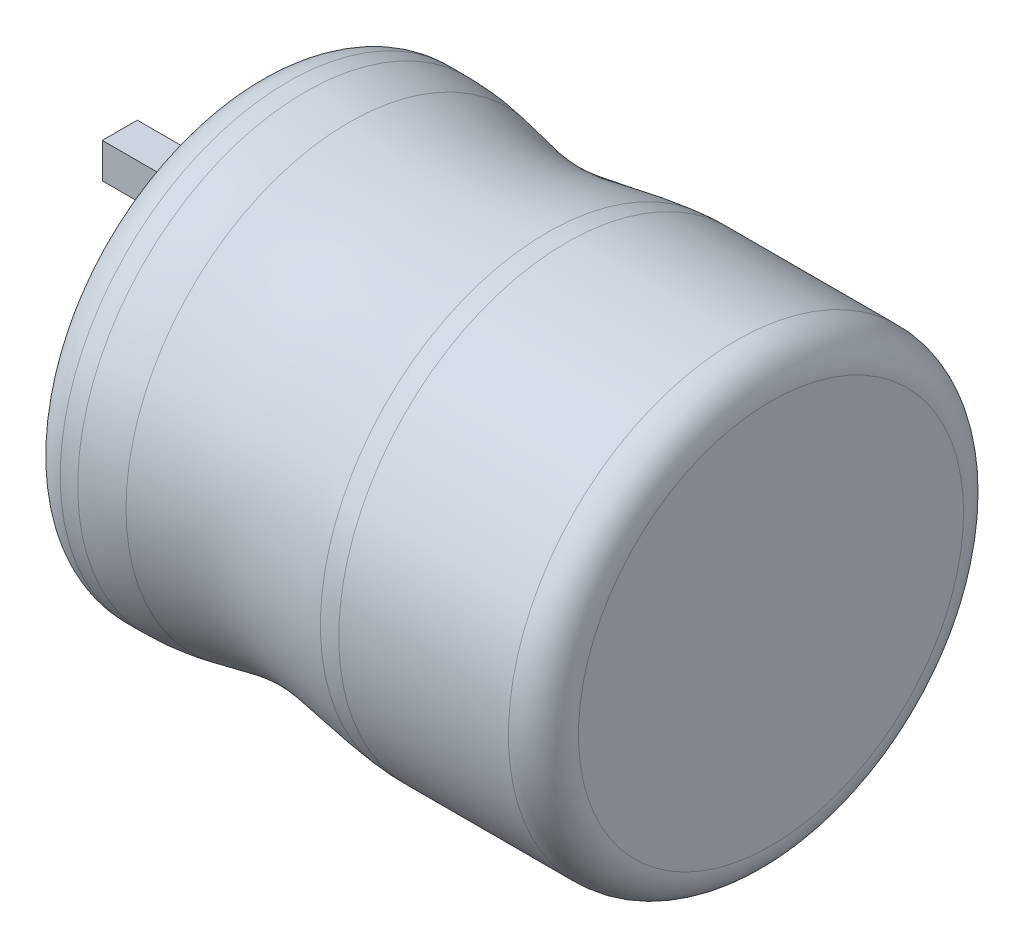
ISO-10303-21;
HEADER;
FILE_DESCRIPTION(('STEP AP214'),'2;1');
FILE_NAME('part.step','',(''),(''),'','','');
FILE_SCHEMA(('AUTOMOTIVE_DESIGN { 1 0 10303 214 1 1 1 1 }'));
ENDSEC;
DATA;
#1=APPLICATION_CONTEXT('core data for automotive mechanical design processes');
#2=APPLICATION_PROTOCOL_DEFINITION('international standard','automotive_design',2000,#1);
#3=PRODUCT_CONTEXT('',#1,'mechanical');
#4=PRODUCT('Part','Part','',(#3));
#5=PRODUCT_RELATED_PRODUCT_CATEGORY('part','',(#4));
#6=PRODUCT_DEFINITION_FORMATION('','',#4);
#7=PRODUCT_DEFINITION_CONTEXT('part definition',#1,'design');
#8=PRODUCT_DEFINITION('design','',#6,#7);
#9=PRODUCT_DEFINITION_SHAPE('','',#8);
#10=(LENGTH_UNIT() NAMED_UNIT(*) SI_UNIT(.MILLI.,.METRE.));
#11=(NAMED_UNIT(*) PLANE_ANGLE_UNIT() SI_UNIT($,.RADIAN.));
#12=(NAMED_UNIT(*) SI_UNIT($,.STERADIAN.) SOLID_ANGLE_UNIT());
#13=UNCERTAINTY_MEASURE_WITH_UNIT(LENGTH_MEASURE(1.E-05),#10,'distance_accuracy_value','');
#14=(GEOMETRIC_REPRESENTATION_CONTEXT(3) GLOBAL_UNCERTAINTY_ASSIGNED_CONTEXT((#13)) GLOBAL_UNIT_ASSIGNED_CONTEXT((#10,
#11,#12)) REPRESENTATION_CONTEXT('',''));
#15=CARTESIAN_POINT('',(0.,0.,0.));
#16=DIRECTION('',(0.,0.,1.));
#17=DIRECTION('',(1.,0.,0.));
#18=AXIS2_PLACEMENT_3D('',#15,#16,#17);
#19=CARTESIAN_POINT('',(0.,0.,0.));
#20=DIRECTION('',(-1.,0.,0.));
#21=DIRECTION('',(0.,0.,1.));
#22=AXIS2_PLACEMENT_3D('',#19,#20,#21);
#23=PLANE('',#22);
#24=DIRECTION('',(0.,0.,1.));
#25=VECTOR('',#24,1.);
#26=CARTESIAN_POINT('',(0.,-1.45,-0.25));
#27=LINE('',#26,#25);
#28=CARTESIAN_POINT('',(0.,-1.45,-0.25));
#29=VERTEX_POINT('',#28);
#30=CARTESIAN_POINT('',(0.,-1.45,0.25));
#31=VERTEX_POINT('',#30);
#32=EDGE_CURVE('E129',#29,#31,#27,.T.);
#33=ORIENTED_EDGE('',*,*,#32,.F.);
#34=DIRECTION('',(0.,-1.,0.));
#35=VECTOR('',#34,1.);
#36=CARTESIAN_POINT('',(0.,-1.45,-0.25));
#37=LINE('',#36,#35);
#38=CARTESIAN_POINT('',(0.,-0.95,-0.25));
#39=VERTEX_POINT('',#38);
#40=EDGE_CURVE('E126',#39,#29,#37,.T.);
#41=ORIENTED_EDGE('',*,*,#40,.F.);
#42=DIRECTION('',(0.,0.,-1.));
#43=VECTOR('',#42,1.);
#44=CARTESIAN_POINT('',(0.,-0.95,-0.25));
#45=LINE('',#44,#43);
#46=CARTESIAN_POINT('',(0.,-0.95,0.25));
#47=VERTEX_POINT('',#46);
#48=EDGE_CURVE('E138',#47,#39,#45,.T.);
#49=ORIENTED_EDGE('',*,*,#48,.F.);
#50=DIRECTION('',(0.,1.,0.));
#51=VECTOR('',#50,1.);
#52=CARTESIAN_POINT('',(0.,-1.45,0.25));
#53=LINE('',#52,#51);
#54=EDGE_CURVE('E146',#31,#47,#53,.T.);
#55=ORIENTED_EDGE('',*,*,#54,.F.);
#56=EDGE_LOOP('',(#33,#41,#49,#55));
#57=FACE_BOUND('',#56,.T.);
#58=CARTESIAN_POINT('',(0.,0.,0.));
#59=DIRECTION('',(1.,0.,0.));
#60=DIRECTION('',(0.,0.,-1.));
#61=AXIS2_PLACEMENT_3D('',#58,#59,#60);
#62=CIRCLE('',#61,2.75);
#63=CARTESIAN_POINT('',(0.,0.,-2.75));
#64=VERTEX_POINT('',#63);
#65=EDGE_CURVE('E11',#64,#64,#62,.T.);
#66=ORIENTED_EDGE('',*,*,#65,.F.);
#67=EDGE_LOOP('',(#66));
#68=FACE_BOUND('',#67,.T.);
#69=DIRECTION('',(0.,0.,1.));
#70=VECTOR('',#69,1.);
#71=CARTESIAN_POINT('',(0.,0.95,0.250000000000001));
#72=LINE('',#71,#70);
#73=CARTESIAN_POINT('',(0.,0.95,-0.249999999999999));
#74=VERTEX_POINT('',#73);
#75=CARTESIAN_POINT('',(0.,0.95,0.250000000000001));
#76=VERTEX_POINT('',#75);
#77=EDGE_CURVE('E417',#74,#76,#72,.T.);
#78=ORIENTED_EDGE('',*,*,#77,.F.);
#79=DIRECTION('',(0.,-1.,0.));
#80=VECTOR('',#79,1.);
#81=CARTESIAN_POINT('',(0.,0.95,-0.249999999999999));
#82=LINE('',#81,#80);
#83=CARTESIAN_POINT('',(0.,1.45,-0.249999999999999));
#84=VERTEX_POINT('',#83);
#85=EDGE_CURVE('E124',#84,#74,#82,.T.);
#86=ORIENTED_EDGE('',*,*,#85,.F.);
#87=DIRECTION('',(0.,0.,-1.));
#88=VECTOR('',#87,1.);
#89=CARTESIAN_POINT('',(0.,1.45,0.250000000000001));
#90=LINE('',#89,#88);
#91=CARTESIAN_POINT('',(0.,1.45,0.250000000000001));
#92=VERTEX_POINT('',#91);
#93=EDGE_CURVE('E120',#92,#84,#90,.T.);
#94=ORIENTED_EDGE('',*,*,#93,.F.);
#95=DIRECTION('',(0.,1.,0.));
#96=VECTOR('',#95,1.);
#97=CARTESIAN_POINT('',(0.,0.95,0.250000000000001));
#98=LINE('',#97,#96);
#99=EDGE_CURVE('E414',#76,#92,#98,.T.);
#100=ORIENTED_EDGE('',*,*,#99,.F.);
#101=EDGE_LOOP('',(#78,#86,#94,#100));
#102=FACE_BOUND('',#101,.T.);
#103=ADVANCED_FACE('F36',(#57,#68,#102),#23,.T.);
#104=CARTESIAN_POINT('',(0.5,0.,0.));
#105=DIRECTION('',(1.,0.,0.));
#106=DIRECTION('',(0.,0.,-1.));
#107=AXIS2_PLACEMENT_3D('',#104,#105,#106);
#108=TOROIDAL_SURFACE('',#107,2.75,0.5);
#109=ORIENTED_EDGE('',*,*,#65,.T.);
#110=EDGE_LOOP('',(#109));
#111=FACE_BOUND('',#110,.T.);
#112=CARTESIAN_POINT('',(0.500000000000004,0.,0.));
#113=DIRECTION('',(1.,0.,0.));
#114=DIRECTION('',(0.,0.,-1.));
#115=AXIS2_PLACEMENT_3D('',#112,#113,#114);
#116=CIRCLE('',#115,3.25);
#117=CARTESIAN_POINT('',(0.500000000000004,0.,-3.25));
#118=VERTEX_POINT('',#117);
#119=EDGE_CURVE('E43',#118,#118,#116,.T.);
#120=ORIENTED_EDGE('',*,*,#119,.F.);
#121=EDGE_LOOP('',(#120));
#122=FACE_BOUND('',#121,.T.);
#123=ADVANCED_FACE('F180',(#111,#122),#108,.T.);
#124=CARTESIAN_POINT('',(7.4,0.,0.));
#125=DIRECTION('',(1.,0.,0.));
#126=DIRECTION('',(0.,0.,-1.));
#127=AXIS2_PLACEMENT_3D('',#124,#125,#126);
#128=CYLINDRICAL_SURFACE('',#127,3.25);
#129=ORIENTED_EDGE('',*,*,#119,.T.);
#130=EDGE_LOOP('',(#129));
#131=FACE_BOUND('',#130,.T.);
#132=CARTESIAN_POINT('',(0.749493844095271,0.,0.));
#133=DIRECTION('',(1.,0.,0.));
#134=DIRECTION('',(0.,0.,-1.));
#135=AXIS2_PLACEMENT_3D('',#132,#133,#134);
#136=CIRCLE('',#135,3.25);
#137=CARTESIAN_POINT('',(0.749493844095271,0.,-3.25));
#138=VERTEX_POINT('',#137);
#139=EDGE_CURVE('E192',#138,#138,#136,.T.);
#140=ORIENTED_EDGE('',*,*,#139,.F.);
#141=EDGE_LOOP('',(#140));
#142=FACE_BOUND('',#141,.T.);
#143=ADVANCED_FACE('F177',(#131,#142),#128,.T.);
#144=CARTESIAN_POINT('',(0.749493844095271,0.,0.));
#145=DIRECTION('',(1.,0.,0.));
#146=DIRECTION('',(0.,0.,-1.));
#147=AXIS2_PLACEMENT_3D('',#144,#145,#146);
#148=DEGENERATE_TOROIDAL_SURFACE('',#147,0.25,3.,.T.);
#149=ORIENTED_EDGE('',*,*,#139,.T.);
#150=EDGE_LOOP('',(#149));
#151=FACE_BOUND('',#150,.T.);
#152=CARTESIAN_POINT('',(1.37333235200828,0.,0.));
#153=DIRECTION('',(1.,0.,0.));
#154=DIRECTION('',(0.,0.,-1.));
#155=AXIS2_PLACEMENT_3D('',#152,#153,#154);
#156=CIRCLE('',#155,3.18442081441038);
#157=CARTESIAN_POINT('',(1.37333235200828,0.,-3.18442081441038));
#158=VERTEX_POINT('',#157);
#159=EDGE_CURVE('E194',#158,#158,#156,.T.);
#160=ORIENTED_EDGE('',*,*,#159,.F.);
#161=EDGE_LOOP('',(#160));
#162=FACE_BOUND('',#161,.T.);
#163=ADVANCED_FACE('F172',(#151,#162),#148,.T.);
#164=CARTESIAN_POINT('',(4.20256601407725,3.2373415653102,0.));
#165=CARTESIAN_POINT('',(3.67985941461151,3.1891711798481,0.));
#166=CARTESIAN_POINT('',(2.63750959583163,2.91310021945568,0.));
#167=CARTESIAN_POINT('',(1.84414867235758,3.08432837049558,0.));
#168=CARTESIAN_POINT('',(1.37333235200828,3.18442081441038,0.));
#169=B_SPLINE_CURVE_WITH_KNOTS('',3,(#164,#165,#166,#167,#168),.UNSPECIFIED.,.F.,.F.,(4,1,4),
(0.0497403572780501,0.342702590857561,0.585924467159021),.UNSPECIFIED.);
#170=CARTESIAN_POINT('',(7.4,0.,0.));
#171=DIRECTION('',(1.,0.,0.));
#172=AXIS1_PLACEMENT('',#170,#171);
#173=SURFACE_OF_REVOLUTION('',#169,#172);
#174=ORIENTED_EDGE('',*,*,#159,.T.);
#175=EDGE_LOOP('',(#174));
#176=FACE_BOUND('',#175,.T.);
#177=CARTESIAN_POINT('',(4.20256601407725,0.,0.));
#178=DIRECTION('',(1.,0.,0.));
#179=DIRECTION('',(0.,0.,-1.));
#180=AXIS2_PLACEMENT_3D('',#177,#178,#179);
#181=CIRCLE('',#180,3.2373415653102);
#182=CARTESIAN_POINT('',(4.20256601407725,0.,-3.2373415653102));
#183=VERTEX_POINT('',#182);
#184=EDGE_CURVE('E199',#183,#183,#181,.T.);
#185=ORIENTED_EDGE('',*,*,#184,.F.);
#186=EDGE_LOOP('',(#185));
#187=FACE_BOUND('',#186,.T.);
#188=ADVANCED_FACE('F167',(#176,#187),#173,.F.);
#189=CARTESIAN_POINT('',(4.47786652655409,0.,0.));
#190=DIRECTION('',(1.,0.,0.));
#191=DIRECTION('',(0.,0.,-1.));
#192=AXIS2_PLACEMENT_3D('',#189,#190,#191);
#193=DEGENERATE_TOROIDAL_SURFACE('',#192,0.25,3.,.T.);
#194=ORIENTED_EDGE('',*,*,#184,.T.);
#195=EDGE_LOOP('',(#194));
#196=FACE_BOUND('',#195,.T.);
#197=CARTESIAN_POINT('',(4.47786652655409,0.,0.));
#198=DIRECTION('',(1.,0.,0.));
#199=DIRECTION('',(0.,0.,-1.));
#200=AXIS2_PLACEMENT_3D('',#197,#198,#199);
#201=CIRCLE('',#200,3.25);
#202=CARTESIAN_POINT('',(4.47786652655409,0.,-3.25));
#203=VERTEX_POINT('',#202);
#204=EDGE_CURVE('E202',#203,#203,#201,.T.);
#205=ORIENTED_EDGE('',*,*,#204,.F.);
#206=EDGE_LOOP('',(#205));
#207=FACE_BOUND('',#206,.T.);
#208=ADVANCED_FACE('F171',(#196,#207),#193,.T.);
#209=CARTESIAN_POINT('',(7.4,0.,0.));
#210=DIRECTION('',(1.,0.,0.));
#211=DIRECTION('',(0.,0.,-1.));
#212=AXIS2_PLACEMENT_3D('',#209,#210,#211);
#213=CYLINDRICAL_SURFACE('',#212,3.25);
#214=ORIENTED_EDGE('',*,*,#204,.T.);
#215=EDGE_LOOP('',(#214));
#216=FACE_BOUND('',#215,.T.);
#217=CARTESIAN_POINT('',(6.9,0.,0.));
#218=DIRECTION('',(1.,0.,0.));
#219=DIRECTION('',(0.,0.,-1.));
#220=AXIS2_PLACEMENT_3D('',#217,#218,#219);
#221=CIRCLE('',#220,3.25);
#222=CARTESIAN_POINT('',(6.9,0.,-3.25));
#223=VERTEX_POINT('',#222);
#224=EDGE_CURVE('E204',#223,#223,#221,.T.);
#225=ORIENTED_EDGE('',*,*,#224,.F.);
#226=EDGE_LOOP('',(#225));
#227=FACE_BOUND('',#226,.T.);
#228=ADVANCED_FACE('F215',(#216,#227),#213,.T.);
#229=CARTESIAN_POINT('',(6.9,0.,0.));
#230=DIRECTION('',(1.,0.,0.));
#231=DIRECTION('',(0.,0.,-1.));
#232=AXIS2_PLACEMENT_3D('',#229,#230,#231);
#233=TOROIDAL_SURFACE('',#232,2.75,0.5);
#234=ORIENTED_EDGE('',*,*,#224,.T.);
#235=EDGE_LOOP('',(#234));
#236=FACE_BOUND('',#235,.T.);
#237=CARTESIAN_POINT('',(7.4,0.,0.));
#238=DIRECTION('',(1.,0.,0.));
#239=DIRECTION('',(0.,0.,-1.));
#240=AXIS2_PLACEMENT_3D('',#237,#238,#239);
#241=CIRCLE('',#240,2.75);
#242=CARTESIAN_POINT('',(7.4,0.,-2.75));
#243=VERTEX_POINT('',#242);
#244=EDGE_CURVE('E157',#243,#243,#241,.T.);
#245=ORIENTED_EDGE('',*,*,#244,.F.);
#246=EDGE_LOOP('',(#245));
#247=FACE_BOUND('',#246,.T.);
#248=ADVANCED_FACE('F213',(#236,#247),#233,.T.);
#249=CARTESIAN_POINT('',(7.4,2.75,0.));
#250=DIRECTION('',(1.,0.,0.));
#251=DIRECTION('',(0.,0.,-1.));
#252=AXIS2_PLACEMENT_3D('',#249,#250,#251);
#253=PLANE('',#252);
#254=ORIENTED_EDGE('',*,*,#244,.T.);
#255=EDGE_LOOP('',(#254));
#256=FACE_BOUND('',#255,.T.);
#257=ADVANCED_FACE('F211',(#256),#253,.T.);
#258=CARTESIAN_POINT('',(-1.9,-1.45,-0.25));
#259=DIRECTION('',(0.,0.,1.));
#260=DIRECTION('',(1.,0.,0.));
#261=AXIS2_PLACEMENT_3D('',#258,#259,#260);
#262=PLANE('',#261);
#263=ORIENTED_EDGE('',*,*,#40,.T.);
#264=DIRECTION('',(1.,0.,0.));
#265=VECTOR('',#264,1.);
#266=CARTESIAN_POINT('',(-1.9,-1.45,-0.25));
#267=LINE('',#266,#265);
#268=CARTESIAN_POINT('',(-1.9,-1.45,-0.25));
#269=VERTEX_POINT('',#268);
#270=EDGE_CURVE('E155',#269,#29,#267,.T.);
#271=ORIENTED_EDGE('',*,*,#270,.F.);
#272=DIRECTION('',(0.,-1.,0.));
#273=VECTOR('',#272,1.);
#274=CARTESIAN_POINT('',(-1.9,-1.45,-0.25));
#275=LINE('',#274,#273);
#276=CARTESIAN_POINT('',(-1.9,-0.95,-0.25));
#277=VERTEX_POINT('',#276);
#278=EDGE_CURVE('E134',#277,#269,#275,.T.);
#279=ORIENTED_EDGE('',*,*,#278,.F.);
#280=DIRECTION('',(1.,0.,0.));
#281=VECTOR('',#280,1.);
#282=CARTESIAN_POINT('',(-1.9,-0.95,-0.25));
#283=LINE('',#282,#281);
#284=EDGE_CURVE('E143',#277,#39,#283,.T.);
#285=ORIENTED_EDGE('',*,*,#284,.T.);
#286=EDGE_LOOP('',(#263,#271,#279,#285));
#287=FACE_BOUND('',#286,.T.);
#288=ADVANCED_FACE('F221',(#287),#262,.F.);
#289=CARTESIAN_POINT('',(-1.9,-1.45,-0.25));
#290=DIRECTION('',(0.,1.,0.));
#291=DIRECTION('',(0.,0.,1.));
#292=AXIS2_PLACEMENT_3D('',#289,#290,#291);
#293=PLANE('',#292);
#294=ORIENTED_EDGE('',*,*,#32,.T.);
#295=DIRECTION('',(1.,0.,0.));
#296=VECTOR('',#295,1.);
#297=CARTESIAN_POINT('',(-1.9,-1.45,0.25));
#298=LINE('',#297,#296);
#299=CARTESIAN_POINT('',(-1.9,-1.45,0.25));
#300=VERTEX_POINT('',#299);
#301=EDGE_CURVE('E152',#300,#31,#298,.T.);
#302=ORIENTED_EDGE('',*,*,#301,.F.);
#303=DIRECTION('',(0.,0.,1.));
#304=VECTOR('',#303,1.);
#305=CARTESIAN_POINT('',(-1.9,-1.45,-0.25));
#306=LINE('',#305,#304);
#307=EDGE_CURVE('E137',#269,#300,#306,.T.);
#308=ORIENTED_EDGE('',*,*,#307,.F.);
#309=ORIENTED_EDGE('',*,*,#270,.T.);
#310=EDGE_LOOP('',(#294,#302,#308,#309));
#311=FACE_BOUND('',#310,.T.);
#312=ADVANCED_FACE('F227',(#311),#293,.F.);
#313=CARTESIAN_POINT('',(-1.9,-1.45,0.25));
#314=DIRECTION('',(0.,0.,-1.));
#315=DIRECTION('',(-1.,0.,0.));
#316=AXIS2_PLACEMENT_3D('',#313,#314,#315);
#317=PLANE('',#316);
#318=ORIENTED_EDGE('',*,*,#54,.T.);
#319=DIRECTION('',(1.,0.,0.));
#320=VECTOR('',#319,1.);
#321=CARTESIAN_POINT('',(-1.9,-0.95,0.25));
#322=LINE('',#321,#320);
#323=CARTESIAN_POINT('',(-1.9,-0.95,0.25));
#324=VERTEX_POINT('',#323);
#325=EDGE_CURVE('E58',#324,#47,#322,.T.);
#326=ORIENTED_EDGE('',*,*,#325,.F.);
#327=DIRECTION('',(0.,1.,0.));
#328=VECTOR('',#327,1.);
#329=CARTESIAN_POINT('',(-1.9,-1.45,0.25));
#330=LINE('',#329,#328);
#331=EDGE_CURVE('E140',#300,#324,#330,.T.);
#332=ORIENTED_EDGE('',*,*,#331,.F.);
#333=ORIENTED_EDGE('',*,*,#301,.T.);
#334=EDGE_LOOP('',(#318,#326,#332,#333));
#335=FACE_BOUND('',#334,.T.);
#336=ADVANCED_FACE('F231',(#335),#317,.F.);
#337=CARTESIAN_POINT('',(-1.9,-0.95,-0.25));
#338=DIRECTION('',(0.,-1.,0.));
#339=DIRECTION('',(0.,0.,-1.));
#340=AXIS2_PLACEMENT_3D('',#337,#338,#339);
#341=PLANE('',#340);
#342=ORIENTED_EDGE('',*,*,#48,.T.);
#343=ORIENTED_EDGE('',*,*,#284,.F.);
#344=DIRECTION('',(0.,0.,-1.));
#345=VECTOR('',#344,1.);
#346=CARTESIAN_POINT('',(-1.9,-0.95,-0.25));
#347=LINE('',#346,#345);
#348=EDGE_CURVE('E142',#324,#277,#347,.T.);
#349=ORIENTED_EDGE('',*,*,#348,.F.);
#350=ORIENTED_EDGE('',*,*,#325,.T.);
#351=EDGE_LOOP('',(#342,#343,#349,#350));
#352=FACE_BOUND('',#351,.T.);
#353=ADVANCED_FACE('F235',(#352),#341,.F.);
#354=CARTESIAN_POINT('',(-1.9,0.,0.));
#355=DIRECTION('',(1.,0.,0.));
#356=DIRECTION('',(0.,0.,-1.));
#357=AXIS2_PLACEMENT_3D('',#354,#355,#356);
#358=PLANE('',#357);
#359=ORIENTED_EDGE('',*,*,#278,.T.);
#360=ORIENTED_EDGE('',*,*,#307,.T.);
#361=ORIENTED_EDGE('',*,*,#331,.T.);
#362=ORIENTED_EDGE('',*,*,#348,.T.);
#363=EDGE_LOOP('',(#359,#360,#361,#362));
#364=FACE_BOUND('',#363,.T.);
#365=ADVANCED_FACE('F239',(#364),#358,.F.);
#366=CARTESIAN_POINT('',(-1.9,0.95,-0.249999999999999));
#367=DIRECTION('',(0.,0.,1.));
#368=DIRECTION('',(0.,-1.,0.));
#369=AXIS2_PLACEMENT_3D('',#366,#367,#368);
#370=PLANE('',#369);
#371=ORIENTED_EDGE('',*,*,#85,.T.);
#372=DIRECTION('',(1.,0.,0.));
#373=VECTOR('',#372,1.);
#374=CARTESIAN_POINT('',(-1.9,0.95,-0.249999999999999));
#375=LINE('',#374,#373);
#376=CARTESIAN_POINT('',(-1.9,0.95,-0.249999999999999));
#377=VERTEX_POINT('',#376);
#378=EDGE_CURVE('E105',#377,#74,#375,.T.);
#379=ORIENTED_EDGE('',*,*,#378,.F.);
#380=DIRECTION('',(0.,-1.,0.));
#381=VECTOR('',#380,1.);
#382=CARTESIAN_POINT('',(-1.9,0.95,-0.249999999999999));
#383=LINE('',#382,#381);
#384=CARTESIAN_POINT('',(-1.9,1.45,-0.249999999999999));
#385=VERTEX_POINT('',#384);
#386=EDGE_CURVE('E112',#385,#377,#383,.T.);
#387=ORIENTED_EDGE('',*,*,#386,.F.);
#388=DIRECTION('',(1.,0.,0.));
#389=VECTOR('',#388,1.);
#390=CARTESIAN_POINT('',(-1.9,1.45,-0.249999999999999));
#391=LINE('',#390,#389);
#392=EDGE_CURVE('E411',#385,#84,#391,.T.);
#393=ORIENTED_EDGE('',*,*,#392,.T.);
#394=EDGE_LOOP('',(#371,#379,#387,#393));
#395=FACE_BOUND('',#394,.T.);
#396=ADVANCED_FACE('F122',(#395),#370,.F.);
#397=CARTESIAN_POINT('',(-1.9,0.95,0.250000000000001));
#398=DIRECTION('',(0.,1.,0.));
#399=DIRECTION('',(0.,0.,1.));
#400=AXIS2_PLACEMENT_3D('',#397,#398,#399);
#401=PLANE('',#400);
#402=ORIENTED_EDGE('',*,*,#77,.T.);
#403=DIRECTION('',(1.,0.,0.));
#404=VECTOR('',#403,1.);
#405=CARTESIAN_POINT('',(-1.9,0.95,0.250000000000001));
#406=LINE('',#405,#404);
#407=CARTESIAN_POINT('',(-1.9,0.95,0.250000000000001));
#408=VERTEX_POINT('',#407);
#409=EDGE_CURVE('E108',#408,#76,#406,.T.);
#410=ORIENTED_EDGE('',*,*,#409,.F.);
#411=DIRECTION('',(0.,0.,1.));
#412=VECTOR('',#411,1.);
#413=CARTESIAN_POINT('',(-1.9,0.95,0.250000000000001));
#414=LINE('',#413,#412);
#415=EDGE_CURVE('E101',#377,#408,#414,.T.);
#416=ORIENTED_EDGE('',*,*,#415,.F.);
#417=ORIENTED_EDGE('',*,*,#378,.T.);
#418=EDGE_LOOP('',(#402,#410,#416,#417));
#419=FACE_BOUND('',#418,.T.);
#420=ADVANCED_FACE('F103',(#419),#401,.F.);
#421=CARTESIAN_POINT('',(-1.9,0.95,0.250000000000001));
#422=DIRECTION('',(0.,0.,-1.));
#423=DIRECTION('',(0.,1.,0.));
#424=AXIS2_PLACEMENT_3D('',#421,#422,#423);
#425=PLANE('',#424);
#426=ORIENTED_EDGE('',*,*,#99,.T.);
#427=DIRECTION('',(1.,0.,0.));
#428=VECTOR('',#427,1.);
#429=CARTESIAN_POINT('',(-1.9,1.45,0.250000000000001));
#430=LINE('',#429,#428);
#431=CARTESIAN_POINT('',(-1.9,1.45,0.250000000000001));
#432=VERTEX_POINT('',#431);
#433=EDGE_CURVE('E50',#432,#92,#430,.T.);
#434=ORIENTED_EDGE('',*,*,#433,.F.);
#435=DIRECTION('',(0.,1.,0.));
#436=VECTOR('',#435,1.);
#437=CARTESIAN_POINT('',(-1.9,0.95,0.250000000000001));
#438=LINE('',#437,#436);
#439=EDGE_CURVE('E111',#408,#432,#438,.T.);
#440=ORIENTED_EDGE('',*,*,#439,.F.);
#441=ORIENTED_EDGE('',*,*,#409,.T.);
#442=EDGE_LOOP('',(#426,#434,#440,#441));
#443=FACE_BOUND('',#442,.T.);
#444=ADVANCED_FACE('F247',(#443),#425,.F.);
#445=CARTESIAN_POINT('',(-1.9,1.45,0.250000000000001));
#446=DIRECTION('',(0.,-1.,0.));
#447=DIRECTION('',(0.,0.,-1.));
#448=AXIS2_PLACEMENT_3D('',#445,#446,#447);
#449=PLANE('',#448);
#450=ORIENTED_EDGE('',*,*,#93,.T.);
#451=ORIENTED_EDGE('',*,*,#392,.F.);
#452=DIRECTION('',(0.,0.,-1.));
#453=VECTOR('',#452,1.);
#454=CARTESIAN_POINT('',(-1.9,1.45,0.250000000000001));
#455=LINE('',#454,#453);
#456=EDGE_CURVE('E116',#432,#385,#455,.T.);
#457=ORIENTED_EDGE('',*,*,#456,.F.);
#458=ORIENTED_EDGE('',*,*,#433,.T.);
#459=EDGE_LOOP('',(#450,#451,#457,#458));
#460=FACE_BOUND('',#459,.T.);
#461=ADVANCED_FACE('F250',(#460),#449,.F.);
#462=CARTESIAN_POINT('',(-1.9,0.,0.));
#463=DIRECTION('',(-1.,0.,0.));
#464=DIRECTION('',(0.,0.,1.));
#465=AXIS2_PLACEMENT_3D('',#462,#463,#464);
#466=PLANE('',#465);
#467=ORIENTED_EDGE('',*,*,#386,.T.);
#468=ORIENTED_EDGE('',*,*,#415,.T.);
#469=ORIENTED_EDGE('',*,*,#439,.T.);
#470=ORIENTED_EDGE('',*,*,#456,.T.);
#471=EDGE_LOOP('',(#467,#468,#469,#470));
#472=FACE_BOUND('',#471,.T.);
#473=ADVANCED_FACE('F115',(#472),#466,.T.);
#474=CLOSED_SHELL('',(#103,#123,#143,#163,#188,#208,#228,#248,#257,#288,#312,#336,#353,#365,
#396,#420,#444,#461,#473));
#475=MANIFOLD_SOLID_BREP('B2',#474);
#476=ADVANCED_BREP_SHAPE_REPRESENTATION('',(#18,#475),#14);
#477=SHAPE_DEFINITION_REPRESENTATION(#9,#476);
ENDSEC;
END-ISO-10303-21;
